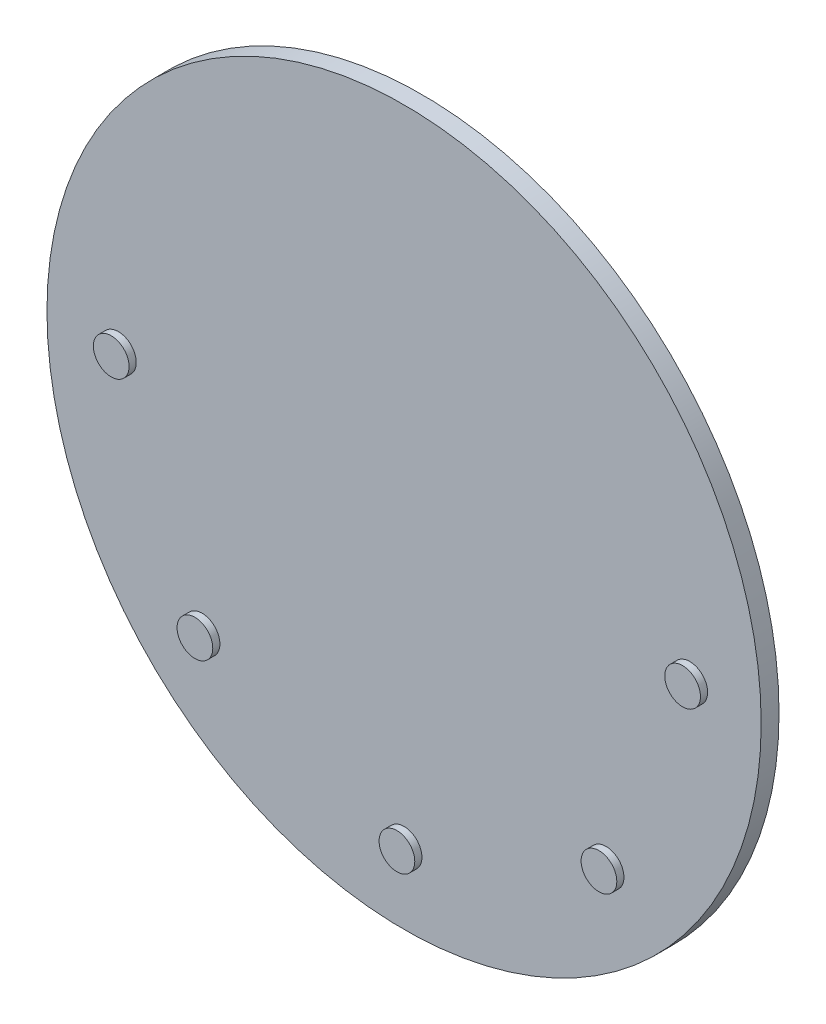
ISO-10303-21;
HEADER;
FILE_DESCRIPTION(('STEP AP214'),'2;1');
FILE_NAME('part.step','',(''),(''),'','','');
FILE_SCHEMA(('AUTOMOTIVE_DESIGN { 1 0 10303 214 1 1 1 1 }'));
ENDSEC;
DATA;
#1=APPLICATION_CONTEXT('core data for automotive mechanical design processes');
#2=APPLICATION_PROTOCOL_DEFINITION('international standard','automotive_design',2000,#1);
#3=PRODUCT_CONTEXT('',#1,'mechanical');
#4=PRODUCT('Part','Part','',(#3));
#5=PRODUCT_RELATED_PRODUCT_CATEGORY('part','',(#4));
#6=PRODUCT_DEFINITION_FORMATION('','',#4);
#7=PRODUCT_DEFINITION_CONTEXT('part definition',#1,'design');
#8=PRODUCT_DEFINITION('design','',#6,#7);
#9=PRODUCT_DEFINITION_SHAPE('','',#8);
#10=(LENGTH_UNIT() NAMED_UNIT(*) SI_UNIT(.MILLI.,.METRE.));
#11=(NAMED_UNIT(*) PLANE_ANGLE_UNIT() SI_UNIT($,.RADIAN.));
#12=(NAMED_UNIT(*) SI_UNIT($,.STERADIAN.) SOLID_ANGLE_UNIT());
#13=UNCERTAINTY_MEASURE_WITH_UNIT(LENGTH_MEASURE(1.E-05),#10,'distance_accuracy_value','');
#14=(GEOMETRIC_REPRESENTATION_CONTEXT(3) GLOBAL_UNCERTAINTY_ASSIGNED_CONTEXT((#13)) GLOBAL_UNIT_ASSIGNED_CONTEXT((#10,
#11,#12)) REPRESENTATION_CONTEXT('',''));
#15=CARTESIAN_POINT('',(0.,0.,0.));
#16=DIRECTION('',(0.,0.,1.));
#17=DIRECTION('',(1.,0.,0.));
#18=AXIS2_PLACEMENT_3D('',#15,#16,#17);
#19=CARTESIAN_POINT('',(0.,0.,5.));
#20=DIRECTION('',(0.,0.,-1.));
#21=DIRECTION('',(-1.,0.,0.));
#22=AXIS2_PLACEMENT_3D('',#19,#20,#21);
#23=CYLINDRICAL_SURFACE('',#22,100.);
#24=CARTESIAN_POINT('',(0.,0.,5.));
#25=DIRECTION('',(0.,0.,1.));
#26=DIRECTION('',(1.,0.,0.));
#27=AXIS2_PLACEMENT_3D('',#24,#25,#26);
#28=CIRCLE('',#27,100.);
#29=CARTESIAN_POINT('',(100.,0.,5.));
#30=VERTEX_POINT('',#29);
#31=EDGE_CURVE('E91',#30,#30,#28,.T.);
#32=ORIENTED_EDGE('',*,*,#31,.F.);
#33=EDGE_LOOP('',(#32));
#34=FACE_BOUND('',#33,.T.);
#35=CARTESIAN_POINT('',(0.,0.,0.));
#36=DIRECTION('',(0.,0.,1.));
#37=DIRECTION('',(1.,0.,0.));
#38=AXIS2_PLACEMENT_3D('',#35,#36,#37);
#39=CIRCLE('',#38,100.);
#40=CARTESIAN_POINT('',(100.,0.,0.));
#41=VERTEX_POINT('',#40);
#42=EDGE_CURVE('E94',#41,#41,#39,.T.);
#43=ORIENTED_EDGE('',*,*,#42,.T.);
#44=EDGE_LOOP('',(#43));
#45=FACE_BOUND('',#44,.T.);
#46=ADVANCED_FACE('F37',(#34,#45),#23,.T.);
#47=CARTESIAN_POINT('',(0.,0.,5.));
#48=DIRECTION('',(0.,0.,1.));
#49=DIRECTION('',(1.,0.,0.));
#50=AXIS2_PLACEMENT_3D('',#47,#48,#49);
#51=PLANE('',#50);
#52=CARTESIAN_POINT('',(80.,0.,5.));
#53=DIRECTION('',(0.,0.,1.));
#54=DIRECTION('',(1.,0.,0.));
#55=AXIS2_PLACEMENT_3D('',#52,#53,#54);
#56=CIRCLE('',#55,5.);
#57=CARTESIAN_POINT('',(85.,0.,5.));
#58=VERTEX_POINT('',#57);
#59=EDGE_CURVE('E10',#58,#58,#56,.T.);
#60=ORIENTED_EDGE('',*,*,#59,.F.);
#61=EDGE_LOOP('',(#60));
#62=FACE_BOUND('',#61,.T.);
#63=CARTESIAN_POINT('',(56.5685424949239,-56.5685424949237,5.));
#64=DIRECTION('',(0.,0.,1.));
#65=DIRECTION('',(1.,0.,0.));
#66=AXIS2_PLACEMENT_3D('',#63,#64,#65);
#67=CIRCLE('',#66,4.99999999999999);
#68=CARTESIAN_POINT('',(61.5685424949239,-56.5685424949237,5.));
#69=VERTEX_POINT('',#68);
#70=EDGE_CURVE('E44',#69,#69,#67,.T.);
#71=ORIENTED_EDGE('',*,*,#70,.F.);
#72=EDGE_LOOP('',(#71));
#73=FACE_BOUND('',#72,.T.);
#74=CARTESIAN_POINT('',(0.,-80.,5.));
#75=DIRECTION('',(0.,0.,1.));
#76=DIRECTION('',(1.,0.,0.));
#77=AXIS2_PLACEMENT_3D('',#74,#75,#76);
#78=CIRCLE('',#77,5.);
#79=CARTESIAN_POINT('',(5.00000000000001,-80.,5.));
#80=VERTEX_POINT('',#79);
#81=EDGE_CURVE('E49',#80,#80,#78,.T.);
#82=ORIENTED_EDGE('',*,*,#81,.F.);
#83=EDGE_LOOP('',(#82));
#84=FACE_BOUND('',#83,.T.);
#85=CARTESIAN_POINT('',(-56.5685424949239,-56.5685424949237,5.));
#86=DIRECTION('',(0.,0.,1.));
#87=DIRECTION('',(1.,0.,0.));
#88=AXIS2_PLACEMENT_3D('',#85,#86,#87);
#89=CIRCLE('',#88,5.);
#90=CARTESIAN_POINT('',(-51.5685424949239,-56.5685424949237,5.));
#91=VERTEX_POINT('',#90);
#92=EDGE_CURVE('E71',#91,#91,#89,.T.);
#93=ORIENTED_EDGE('',*,*,#92,.F.);
#94=EDGE_LOOP('',(#93));
#95=FACE_BOUND('',#94,.T.);
#96=CARTESIAN_POINT('',(-80.,0.,5.));
#97=DIRECTION('',(0.,0.,1.));
#98=DIRECTION('',(1.,0.,0.));
#99=AXIS2_PLACEMENT_3D('',#96,#97,#98);
#100=CIRCLE('',#99,5.);
#101=CARTESIAN_POINT('',(-75.,0.,5.));
#102=VERTEX_POINT('',#101);
#103=EDGE_CURVE('E81',#102,#102,#100,.T.);
#104=ORIENTED_EDGE('',*,*,#103,.F.);
#105=EDGE_LOOP('',(#104));
#106=FACE_BOUND('',#105,.T.);
#107=ORIENTED_EDGE('',*,*,#31,.T.);
#108=EDGE_LOOP('',(#107));
#109=FACE_BOUND('',#108,.T.);
#110=ADVANCED_FACE('F125',(#62,#73,#84,#95,#106,#109),#51,.T.);
#111=CARTESIAN_POINT('',(0.,0.,0.));
#112=DIRECTION('',(0.,0.,1.));
#113=DIRECTION('',(1.,0.,0.));
#114=AXIS2_PLACEMENT_3D('',#111,#112,#113);
#115=PLANE('',#114);
#116=CARTESIAN_POINT('',(80.,0.,0.));
#117=DIRECTION('',(0.,0.,1.));
#118=DIRECTION('',(1.,0.,0.));
#119=AXIS2_PLACEMENT_3D('',#116,#117,#118);
#120=CIRCLE('',#119,5.);
#121=CARTESIAN_POINT('',(85.,0.,0.));
#122=VERTEX_POINT('',#121);
#123=EDGE_CURVE('E40',#122,#122,#120,.T.);
#124=ORIENTED_EDGE('',*,*,#123,.T.);
#125=EDGE_LOOP('',(#124));
#126=FACE_BOUND('',#125,.T.);
#127=CARTESIAN_POINT('',(56.5685424949239,-56.5685424949237,0.));
#128=DIRECTION('',(0.,0.,1.));
#129=DIRECTION('',(1.,0.,0.));
#130=AXIS2_PLACEMENT_3D('',#127,#128,#129);
#131=CIRCLE('',#130,4.99999999999999);
#132=CARTESIAN_POINT('',(61.5685424949239,-56.5685424949237,0.));
#133=VERTEX_POINT('',#132);
#134=EDGE_CURVE('E60',#133,#133,#131,.T.);
#135=ORIENTED_EDGE('',*,*,#134,.T.);
#136=EDGE_LOOP('',(#135));
#137=FACE_BOUND('',#136,.T.);
#138=CARTESIAN_POINT('',(0.,-80.,0.));
#139=DIRECTION('',(0.,0.,1.));
#140=DIRECTION('',(1.,0.,0.));
#141=AXIS2_PLACEMENT_3D('',#138,#139,#140);
#142=CIRCLE('',#141,5.);
#143=CARTESIAN_POINT('',(5.00000000000001,-80.,0.));
#144=VERTEX_POINT('',#143);
#145=EDGE_CURVE('E68',#144,#144,#142,.T.);
#146=ORIENTED_EDGE('',*,*,#145,.T.);
#147=EDGE_LOOP('',(#146));
#148=FACE_BOUND('',#147,.T.);
#149=CARTESIAN_POINT('',(-56.5685424949239,-56.5685424949237,0.));
#150=DIRECTION('',(0.,0.,1.));
#151=DIRECTION('',(1.,0.,0.));
#152=AXIS2_PLACEMENT_3D('',#149,#150,#151);
#153=CIRCLE('',#152,5.);
#154=CARTESIAN_POINT('',(-51.5685424949239,-56.5685424949237,0.));
#155=VERTEX_POINT('',#154);
#156=EDGE_CURVE('E78',#155,#155,#153,.T.);
#157=ORIENTED_EDGE('',*,*,#156,.T.);
#158=EDGE_LOOP('',(#157));
#159=FACE_BOUND('',#158,.T.);
#160=CARTESIAN_POINT('',(-80.,0.,0.));
#161=DIRECTION('',(0.,0.,1.));
#162=DIRECTION('',(1.,0.,0.));
#163=AXIS2_PLACEMENT_3D('',#160,#161,#162);
#164=CIRCLE('',#163,5.);
#165=CARTESIAN_POINT('',(-75.,0.,0.));
#166=VERTEX_POINT('',#165);
#167=EDGE_CURVE('E88',#166,#166,#164,.T.);
#168=ORIENTED_EDGE('',*,*,#167,.T.);
#169=EDGE_LOOP('',(#168));
#170=FACE_BOUND('',#169,.T.);
#171=ORIENTED_EDGE('',*,*,#42,.F.);
#172=EDGE_LOOP('',(#171));
#173=FACE_BOUND('',#172,.T.);
#174=ADVANCED_FACE('F105',(#126,#137,#148,#159,#170,#173),#115,.F.);
#175=CARTESIAN_POINT('',(-80.,0.,-2.));
#176=DIRECTION('',(0.,0.,1.));
#177=DIRECTION('',(1.,0.,0.));
#178=AXIS2_PLACEMENT_3D('',#175,#176,#177);
#179=PLANE('',#178);
#180=CARTESIAN_POINT('',(-80.,0.,-2.));
#181=DIRECTION('',(0.,0.,1.));
#182=DIRECTION('',(1.,0.,0.));
#183=AXIS2_PLACEMENT_3D('',#180,#181,#182);
#184=CIRCLE('',#183,5.);
#185=CARTESIAN_POINT('',(-75.,0.,-2.));
#186=VERTEX_POINT('',#185);
#187=EDGE_CURVE('E85',#186,#186,#184,.T.);
#188=ORIENTED_EDGE('',*,*,#187,.F.);
#189=EDGE_LOOP('',(#188));
#190=FACE_BOUND('',#189,.T.);
#191=ADVANCED_FACE('F137',(#190),#179,.F.);
#192=CARTESIAN_POINT('',(-80.,0.,-2.));
#193=DIRECTION('',(0.,0.,1.));
#194=DIRECTION('',(1.,0.,0.));
#195=AXIS2_PLACEMENT_3D('',#192,#193,#194);
#196=CYLINDRICAL_SURFACE('',#195,5.);
#197=ORIENTED_EDGE('',*,*,#187,.T.);
#198=EDGE_LOOP('',(#197));
#199=FACE_BOUND('',#198,.T.);
#200=ORIENTED_EDGE('',*,*,#167,.F.);
#201=EDGE_LOOP('',(#200));
#202=FACE_BOUND('',#201,.T.);
#203=ADVANCED_FACE('F142',(#199,#202),#196,.T.);
#204=ORIENTED_EDGE('',*,*,#103,.T.);
#205=EDGE_LOOP('',(#204));
#206=FACE_BOUND('',#205,.T.);
#207=CARTESIAN_POINT('',(-80.,0.,7.));
#208=DIRECTION('',(0.,0.,1.));
#209=DIRECTION('',(1.,0.,0.));
#210=AXIS2_PLACEMENT_3D('',#207,#208,#209);
#211=CIRCLE('',#210,5.);
#212=CARTESIAN_POINT('',(-75.,0.,7.));
#213=VERTEX_POINT('',#212);
#214=EDGE_CURVE('E82',#213,#213,#211,.T.);
#215=ORIENTED_EDGE('',*,*,#214,.F.);
#216=EDGE_LOOP('',(#215));
#217=FACE_BOUND('',#216,.T.);
#218=ADVANCED_FACE('F147',(#206,#217),#196,.T.);
#219=CARTESIAN_POINT('',(-80.,0.,7.));
#220=DIRECTION('',(0.,0.,1.));
#221=DIRECTION('',(1.,0.,0.));
#222=AXIS2_PLACEMENT_3D('',#219,#220,#221);
#223=PLANE('',#222);
#224=ORIENTED_EDGE('',*,*,#214,.T.);
#225=EDGE_LOOP('',(#224));
#226=FACE_BOUND('',#225,.T.);
#227=ADVANCED_FACE('F149',(#226),#223,.T.);
#228=CARTESIAN_POINT('',(-56.5685424949239,-56.5685424949237,-2.));
#229=DIRECTION('',(0.,0.,1.));
#230=DIRECTION('',(1.,0.,0.));
#231=AXIS2_PLACEMENT_3D('',#228,#229,#230);
#232=PLANE('',#231);
#233=CARTESIAN_POINT('',(-56.5685424949239,-56.5685424949237,-2.));
#234=DIRECTION('',(0.,0.,1.));
#235=DIRECTION('',(1.,0.,0.));
#236=AXIS2_PLACEMENT_3D('',#233,#234,#235);
#237=CIRCLE('',#236,5.);
#238=CARTESIAN_POINT('',(-51.5685424949239,-56.5685424949237,-2.));
#239=VERTEX_POINT('',#238);
#240=EDGE_CURVE('E75',#239,#239,#237,.T.);
#241=ORIENTED_EDGE('',*,*,#240,.F.);
#242=EDGE_LOOP('',(#241));
#243=FACE_BOUND('',#242,.T.);
#244=ADVANCED_FACE('F154',(#243),#232,.F.);
#245=CARTESIAN_POINT('',(-56.5685424949239,-56.5685424949237,-2.));
#246=DIRECTION('',(0.,0.,1.));
#247=DIRECTION('',(1.,0.,0.));
#248=AXIS2_PLACEMENT_3D('',#245,#246,#247);
#249=CYLINDRICAL_SURFACE('',#248,5.);
#250=ORIENTED_EDGE('',*,*,#240,.T.);
#251=EDGE_LOOP('',(#250));
#252=FACE_BOUND('',#251,.T.);
#253=ORIENTED_EDGE('',*,*,#156,.F.);
#254=EDGE_LOOP('',(#253));
#255=FACE_BOUND('',#254,.T.);
#256=ADVANCED_FACE('F160',(#252,#255),#249,.T.);
#257=ORIENTED_EDGE('',*,*,#92,.T.);
#258=EDGE_LOOP('',(#257));
#259=FACE_BOUND('',#258,.T.);
#260=CARTESIAN_POINT('',(-56.5685424949239,-56.5685424949237,7.));
#261=DIRECTION('',(0.,0.,1.));
#262=DIRECTION('',(1.,0.,0.));
#263=AXIS2_PLACEMENT_3D('',#260,#261,#262);
#264=CIRCLE('',#263,5.);
#265=CARTESIAN_POINT('',(-51.5685424949239,-56.5685424949237,7.));
#266=VERTEX_POINT('',#265);
#267=EDGE_CURVE('E72',#266,#266,#264,.T.);
#268=ORIENTED_EDGE('',*,*,#267,.F.);
#269=EDGE_LOOP('',(#268));
#270=FACE_BOUND('',#269,.T.);
#271=ADVANCED_FACE('F156',(#259,#270),#249,.T.);
#272=CARTESIAN_POINT('',(-56.5685424949239,-56.5685424949237,7.));
#273=DIRECTION('',(0.,0.,1.));
#274=DIRECTION('',(1.,0.,0.));
#275=AXIS2_PLACEMENT_3D('',#272,#273,#274);
#276=PLANE('',#275);
#277=ORIENTED_EDGE('',*,*,#267,.T.);
#278=EDGE_LOOP('',(#277));
#279=FACE_BOUND('',#278,.T.);
#280=ADVANCED_FACE('F159',(#279),#276,.T.);
#281=CARTESIAN_POINT('',(0.,-80.,-2.));
#282=DIRECTION('',(0.,0.,1.));
#283=DIRECTION('',(1.,0.,0.));
#284=AXIS2_PLACEMENT_3D('',#281,#282,#283);
#285=PLANE('',#284);
#286=CARTESIAN_POINT('',(0.,-80.,-2.));
#287=DIRECTION('',(0.,0.,1.));
#288=DIRECTION('',(1.,0.,0.));
#289=AXIS2_PLACEMENT_3D('',#286,#287,#288);
#290=CIRCLE('',#289,5.);
#291=CARTESIAN_POINT('',(5.00000000000001,-80.,-2.));
#292=VERTEX_POINT('',#291);
#293=EDGE_CURVE('E65',#292,#292,#290,.T.);
#294=ORIENTED_EDGE('',*,*,#293,.F.);
#295=EDGE_LOOP('',(#294));
#296=FACE_BOUND('',#295,.T.);
#297=ADVANCED_FACE('F167',(#296),#285,.F.);
#298=CARTESIAN_POINT('',(0.,-80.,-2.));
#299=DIRECTION('',(0.,0.,1.));
#300=DIRECTION('',(1.,0.,0.));
#301=AXIS2_PLACEMENT_3D('',#298,#299,#300);
#302=CYLINDRICAL_SURFACE('',#301,5.);
#303=ORIENTED_EDGE('',*,*,#293,.T.);
#304=EDGE_LOOP('',(#303));
#305=FACE_BOUND('',#304,.T.);
#306=ORIENTED_EDGE('',*,*,#145,.F.);
#307=EDGE_LOOP('',(#306));
#308=FACE_BOUND('',#307,.T.);
#309=ADVANCED_FACE('F172',(#305,#308),#302,.T.);
#310=ORIENTED_EDGE('',*,*,#81,.T.);
#311=EDGE_LOOP('',(#310));
#312=FACE_BOUND('',#311,.T.);
#313=CARTESIAN_POINT('',(0.,-80.,7.));
#314=DIRECTION('',(0.,0.,1.));
#315=DIRECTION('',(1.,0.,0.));
#316=AXIS2_PLACEMENT_3D('',#313,#314,#315);
#317=CIRCLE('',#316,5.);
#318=CARTESIAN_POINT('',(5.00000000000001,-80.,7.));
#319=VERTEX_POINT('',#318);
#320=EDGE_CURVE('E62',#319,#319,#317,.T.);
#321=ORIENTED_EDGE('',*,*,#320,.F.);
#322=EDGE_LOOP('',(#321));
#323=FACE_BOUND('',#322,.T.);
#324=ADVANCED_FACE('F169',(#312,#323),#302,.T.);
#325=CARTESIAN_POINT('',(0.,-80.,7.));
#326=DIRECTION('',(0.,0.,1.));
#327=DIRECTION('',(1.,0.,0.));
#328=AXIS2_PLACEMENT_3D('',#325,#326,#327);
#329=PLANE('',#328);
#330=ORIENTED_EDGE('',*,*,#320,.T.);
#331=EDGE_LOOP('',(#330));
#332=FACE_BOUND('',#331,.T.);
#333=ADVANCED_FACE('F120',(#332),#329,.T.);
#334=CARTESIAN_POINT('',(56.5685424949239,-56.5685424949237,-2.));
#335=DIRECTION('',(0.,0.,1.));
#336=DIRECTION('',(1.,0.,0.));
#337=AXIS2_PLACEMENT_3D('',#334,#335,#336);
#338=PLANE('',#337);
#339=CARTESIAN_POINT('',(56.5685424949239,-56.5685424949237,-2.));
#340=DIRECTION('',(0.,0.,1.));
#341=DIRECTION('',(1.,0.,0.));
#342=AXIS2_PLACEMENT_3D('',#339,#340,#341);
#343=CIRCLE('',#342,4.99999999999999);
#344=CARTESIAN_POINT('',(61.5685424949239,-56.5685424949237,-2.));
#345=VERTEX_POINT('',#344);
#346=EDGE_CURVE('E58',#345,#345,#343,.T.);
#347=ORIENTED_EDGE('',*,*,#346,.F.);
#348=EDGE_LOOP('',(#347));
#349=FACE_BOUND('',#348,.T.);
#350=ADVANCED_FACE('F111',(#349),#338,.F.);
#351=CARTESIAN_POINT('',(56.5685424949239,-56.5685424949237,-2.));
#352=DIRECTION('',(0.,0.,1.));
#353=DIRECTION('',(1.,0.,0.));
#354=AXIS2_PLACEMENT_3D('',#351,#352,#353);
#355=CYLINDRICAL_SURFACE('',#354,4.99999999999999);
#356=ORIENTED_EDGE('',*,*,#346,.T.);
#357=EDGE_LOOP('',(#356));
#358=FACE_BOUND('',#357,.T.);
#359=ORIENTED_EDGE('',*,*,#134,.F.);
#360=EDGE_LOOP('',(#359));
#361=FACE_BOUND('',#360,.T.);
#362=ADVANCED_FACE('F108',(#358,#361),#355,.T.);
#363=ORIENTED_EDGE('',*,*,#70,.T.);
#364=EDGE_LOOP('',(#363));
#365=FACE_BOUND('',#364,.T.);
#366=CARTESIAN_POINT('',(56.5685424949239,-56.5685424949237,7.));
#367=DIRECTION('',(0.,0.,1.));
#368=DIRECTION('',(1.,0.,0.));
#369=AXIS2_PLACEMENT_3D('',#366,#367,#368);
#370=CIRCLE('',#369,4.99999999999999);
#371=CARTESIAN_POINT('',(61.5685424949239,-56.5685424949237,7.));
#372=VERTEX_POINT('',#371);
#373=EDGE_CURVE('E55',#372,#372,#370,.T.);
#374=ORIENTED_EDGE('',*,*,#373,.F.);
#375=EDGE_LOOP('',(#374));
#376=FACE_BOUND('',#375,.T.);
#377=ADVANCED_FACE('F110',(#365,#376),#355,.T.);
#378=CARTESIAN_POINT('',(56.5685424949239,-56.5685424949237,7.));
#379=DIRECTION('',(0.,0.,1.));
#380=DIRECTION('',(1.,0.,0.));
#381=AXIS2_PLACEMENT_3D('',#378,#379,#380);
#382=PLANE('',#381);
#383=ORIENTED_EDGE('',*,*,#373,.T.);
#384=EDGE_LOOP('',(#383));
#385=FACE_BOUND('',#384,.T.);
#386=ADVANCED_FACE('F118',(#385),#382,.T.);
#387=CARTESIAN_POINT('',(80.,0.,-2.));
#388=DIRECTION('',(0.,0.,1.));
#389=DIRECTION('',(1.,0.,0.));
#390=AXIS2_PLACEMENT_3D('',#387,#388,#389);
#391=PLANE('',#390);
#392=CARTESIAN_POINT('',(80.,0.,-2.));
#393=DIRECTION('',(0.,0.,1.));
#394=DIRECTION('',(1.,0.,0.));
#395=AXIS2_PLACEMENT_3D('',#392,#393,#394);
#396=CIRCLE('',#395,5.);
#397=CARTESIAN_POINT('',(85.,0.,-2.));
#398=VERTEX_POINT('',#397);
#399=EDGE_CURVE('E53',#398,#398,#396,.T.);
#400=ORIENTED_EDGE('',*,*,#399,.F.);
#401=EDGE_LOOP('',(#400));
#402=FACE_BOUND('',#401,.T.);
#403=ADVANCED_FACE('F208',(#402),#391,.F.);
#404=CARTESIAN_POINT('',(80.,0.,-2.));
#405=DIRECTION('',(0.,0.,1.));
#406=DIRECTION('',(1.,0.,0.));
#407=AXIS2_PLACEMENT_3D('',#404,#405,#406);
#408=CYLINDRICAL_SURFACE('',#407,5.);
#409=ORIENTED_EDGE('',*,*,#399,.T.);
#410=EDGE_LOOP('',(#409));
#411=FACE_BOUND('',#410,.T.);
#412=ORIENTED_EDGE('',*,*,#123,.F.);
#413=EDGE_LOOP('',(#412));
#414=FACE_BOUND('',#413,.T.);
#415=ADVANCED_FACE('F218',(#411,#414),#408,.T.);
#416=ORIENTED_EDGE('',*,*,#59,.T.);
#417=EDGE_LOOP('',(#416));
#418=FACE_BOUND('',#417,.T.);
#419=CARTESIAN_POINT('',(80.,0.,7.));
#420=DIRECTION('',(0.,0.,1.));
#421=DIRECTION('',(1.,0.,0.));
#422=AXIS2_PLACEMENT_3D('',#419,#420,#421);
#423=CIRCLE('',#422,5.);
#424=CARTESIAN_POINT('',(85.,0.,7.));
#425=VERTEX_POINT('',#424);
#426=EDGE_CURVE('E252',#425,#425,#423,.T.);
#427=ORIENTED_EDGE('',*,*,#426,.F.);
#428=EDGE_LOOP('',(#427));
#429=FACE_BOUND('',#428,.T.);
#430=ADVANCED_FACE('F228',(#418,#429),#408,.T.);
#431=CARTESIAN_POINT('',(80.,0.,7.));
#432=DIRECTION('',(0.,0.,1.));
#433=DIRECTION('',(1.,0.,0.));
#434=AXIS2_PLACEMENT_3D('',#431,#432,#433);
#435=PLANE('',#434);
#436=ORIENTED_EDGE('',*,*,#426,.T.);
#437=EDGE_LOOP('',(#436));
#438=FACE_BOUND('',#437,.T.);
#439=ADVANCED_FACE('F238',(#438),#435,.T.);
#440=CLOSED_SHELL('',(#46,#110,#174,#191,#203,#218,#227,#244,#256,#271,#280,#297,#309,#324,#333,
#350,#362,#377,#386,#403,#415,#430,#439));
#441=MANIFOLD_SOLID_BREP('B2',#440);
#442=ADVANCED_BREP_SHAPE_REPRESENTATION('',(#18,#441),#14);
#443=SHAPE_DEFINITION_REPRESENTATION(#9,#442);
ENDSEC;
END-ISO-10303-21;
